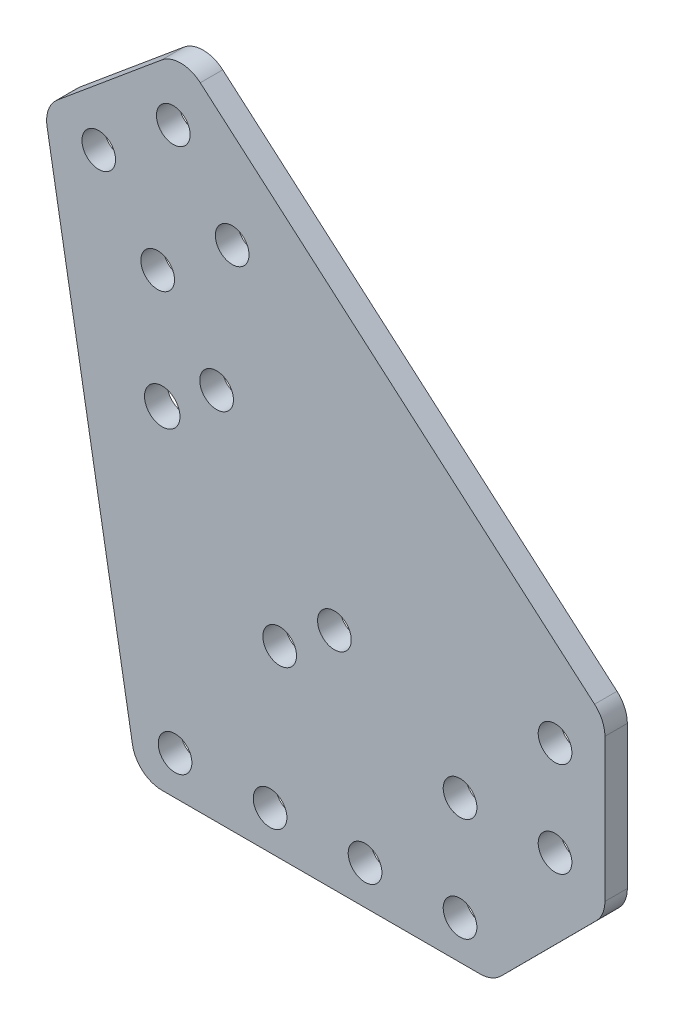
ISO-10303-21;
HEADER;
FILE_DESCRIPTION(('STEP AP214'),'2;1');
FILE_NAME('part.step','',(''),(''),'','','');
FILE_SCHEMA(('AUTOMOTIVE_DESIGN { 1 0 10303 214 1 1 1 1 }'));
ENDSEC;
DATA;
#1=APPLICATION_CONTEXT('core data for automotive mechanical design processes');
#2=APPLICATION_PROTOCOL_DEFINITION('international standard','automotive_design',2000,#1);
#3=PRODUCT_CONTEXT('',#1,'mechanical');
#4=PRODUCT('Part','Part','',(#3));
#5=PRODUCT_RELATED_PRODUCT_CATEGORY('part','',(#4));
#6=PRODUCT_DEFINITION_FORMATION('','',#4);
#7=PRODUCT_DEFINITION_CONTEXT('part definition',#1,'design');
#8=PRODUCT_DEFINITION('design','',#6,#7);
#9=PRODUCT_DEFINITION_SHAPE('','',#8);
#10=(LENGTH_UNIT() NAMED_UNIT(*) SI_UNIT(.MILLI.,.METRE.));
#11=(NAMED_UNIT(*) PLANE_ANGLE_UNIT() SI_UNIT($,.RADIAN.));
#12=(NAMED_UNIT(*) SI_UNIT($,.STERADIAN.) SOLID_ANGLE_UNIT());
#13=UNCERTAINTY_MEASURE_WITH_UNIT(LENGTH_MEASURE(1.E-05),#10,'distance_accuracy_value','');
#14=(GEOMETRIC_REPRESENTATION_CONTEXT(3) GLOBAL_UNCERTAINTY_ASSIGNED_CONTEXT((#13)) GLOBAL_UNIT_ASSIGNED_CONTEXT((#10,
#11,#12)) REPRESENTATION_CONTEXT('',''));
#15=CARTESIAN_POINT('',(0.,0.,0.));
#16=DIRECTION('',(0.,0.,1.));
#17=DIRECTION('',(1.,0.,0.));
#18=AXIS2_PLACEMENT_3D('',#15,#16,#17);
#19=CARTESIAN_POINT('',(0.,0.,3.));
#20=DIRECTION('',(0.,0.,1.));
#21=DIRECTION('',(1.,0.,0.));
#22=AXIS2_PLACEMENT_3D('',#19,#20,#21);
#23=PLANE('',#22);
#24=CARTESIAN_POINT('',(-164.189999824985,19.901668358418,3.));
#25=DIRECTION('',(0.,0.,1.));
#26=DIRECTION('',(1.,0.,0.));
#27=AXIS2_PLACEMENT_3D('',#24,#25,#26);
#28=CIRCLE('',#27,2.36830106821784);
#29=CARTESIAN_POINT('',(-161.821698756767,19.901668358418,3.));
#30=VERTEX_POINT('',#29);
#31=EDGE_CURVE('E329',#30,#30,#28,.T.);
#32=ORIENTED_EDGE('',*,*,#31,.F.);
#33=EDGE_LOOP('',(#32));
#34=FACE_BOUND('',#33,.T.);
#35=CARTESIAN_POINT('',(-149.776854941466,-19.3863630538156,3.));
#36=DIRECTION('',(0.,0.,1.));
#37=DIRECTION('',(1.,0.,0.));
#38=AXIS2_PLACEMENT_3D('',#35,#36,#37);
#39=CIRCLE('',#38,2.25000000048249);
#40=CARTESIAN_POINT('',(-147.526854940983,-19.3863630538156,3.));
#41=VERTEX_POINT('',#40);
#42=EDGE_CURVE('E317',#41,#41,#39,.T.);
#43=ORIENTED_EDGE('',*,*,#42,.F.);
#44=EDGE_LOOP('',(#43));
#45=FACE_BOUND('',#44,.T.);
#46=CARTESIAN_POINT('',(-124.376854941466,-5.51796305374064,3.));
#47=DIRECTION('',(0.,0.,1.));
#48=DIRECTION('',(1.,0.,0.));
#49=AXIS2_PLACEMENT_3D('',#46,#47,#48);
#50=CIRCLE('',#49,2.25000000029453);
#51=CARTESIAN_POINT('',(-122.126854941172,-5.51796305374064,3.));
#52=VERTEX_POINT('',#51);
#53=EDGE_CURVE('E305',#52,#52,#50,.T.);
#54=ORIENTED_EDGE('',*,*,#53,.F.);
#55=EDGE_LOOP('',(#54));
#56=FACE_BOUND('',#55,.T.);
#57=CARTESIAN_POINT('',(-141.172189922376,5.48847701010607,3.));
#58=DIRECTION('',(0.,0.,1.));
#59=DIRECTION('',(1.,0.,0.));
#60=AXIS2_PLACEMENT_3D('',#57,#58,#59);
#61=CIRCLE('',#60,2.25000000002542);
#62=CARTESIAN_POINT('',(-138.922189922351,5.48847701010607,3.));
#63=VERTEX_POINT('',#62);
#64=EDGE_CURVE('E293',#63,#63,#61,.T.);
#65=ORIENTED_EDGE('',*,*,#64,.F.);
#66=EDGE_LOOP('',(#65));
#67=FACE_BOUND('',#66,.T.);
#68=CARTESIAN_POINT('',(-111.676854941467,7.18203694625944,3.));
#69=DIRECTION('',(0.,0.,1.));
#70=DIRECTION('',(1.,0.,0.));
#71=AXIS2_PLACEMENT_3D('',#68,#69,#70);
#72=CIRCLE('',#71,2.25000000029456);
#73=CARTESIAN_POINT('',(-109.426854941172,7.18203694625944,3.));
#74=VERTEX_POINT('',#73);
#75=EDGE_CURVE('E281',#74,#74,#72,.T.);
#76=ORIENTED_EDGE('',*,*,#75,.F.);
#77=EDGE_LOOP('',(#76));
#78=FACE_BOUND('',#77,.T.);
#79=CARTESIAN_POINT('',(-162.712910790992,53.2161141238411,3.));
#80=DIRECTION('',(0.,0.,1.));
#81=DIRECTION('',(1.,0.,0.));
#82=AXIS2_PLACEMENT_3D('',#79,#80,#81);
#83=CIRCLE('',#82,2.2499999999438);
#84=CARTESIAN_POINT('',(-160.462910791048,53.2161141238411,3.));
#85=VERTEX_POINT('',#84);
#86=EDGE_CURVE('E269',#85,#85,#83,.T.);
#87=ORIENTED_EDGE('',*,*,#86,.F.);
#88=EDGE_LOOP('',(#87));
#89=FACE_BOUND('',#88,.T.);
#90=CARTESIAN_POINT('',(-154.836997815216,43.2531830893514,3.));
#91=DIRECTION('',(0.,0.,1.));
#92=DIRECTION('',(1.,0.,0.));
#93=AXIS2_PLACEMENT_3D('',#90,#91,#92);
#94=CIRCLE('',#93,2.24999999995231);
#95=CARTESIAN_POINT('',(-152.586997815263,43.2531830893514,3.));
#96=VERTEX_POINT('',#95);
#97=EDGE_CURVE('E258',#96,#96,#94,.T.);
#98=ORIENTED_EDGE('',*,*,#97,.F.);
#99=EDGE_LOOP('',(#98));
#100=FACE_BOUND('',#99,.T.);
#101=DIRECTION('',(1.,0.,0.));
#102=VECTOR('',#101,1.);
#103=CARTESIAN_POINT('',(-120.053839996217,-24.5679630538153,3.));
#104=LINE('',#103,#102);
#105=CARTESIAN_POINT('',(-164.224876802473,-24.5679630538149,3.));
#106=VERTEX_POINT('',#105);
#107=CARTESIAN_POINT('',(-121.714126708499,-24.5679630538153,3.));
#108=VERTEX_POINT('',#107);
#109=EDGE_CURVE('E174',#106,#108,#104,.T.);
#110=ORIENTED_EDGE('',*,*,#109,.T.);
#111=CARTESIAN_POINT('',(-121.714126708499,-20.5679630538153,3.));
#112=DIRECTION('',(0.,0.,1.));
#113=DIRECTION('',(1.,0.,0.));
#114=AXIS2_PLACEMENT_3D('',#111,#112,#113);
#115=CIRCLE('',#114,4.);
#116=CARTESIAN_POINT('',(-118.881560526476,-23.3922450553974,3.));
#117=VERTEX_POINT('',#116);
#118=EDGE_CURVE('E206',#108,#117,#115,.T.);
#119=ORIENTED_EDGE('',*,*,#118,.T.);
#120=DIRECTION('',(0.706070500395531,0.708141545505703,0.));
#121=VECTOR('',#120,1.);
#122=CARTESIAN_POINT('',(-105.010365496768,-9.48036305374793,3.));
#123=LINE('',#122,#121);
#124=CARTESIAN_POINT('',(-106.177799314745,-10.6512211871421,3.));
#125=VERTEX_POINT('',#124);
#126=EDGE_CURVE('E156',#117,#125,#123,.T.);
#127=ORIENTED_EDGE('',*,*,#126,.T.);
#128=CARTESIAN_POINT('',(-109.010365496768,-7.82693918555994,3.));
#129=DIRECTION('',(0.,0.,1.));
#130=DIRECTION('',(1.,0.,0.));
#131=AXIS2_PLACEMENT_3D('',#128,#129,#130);
#132=CIRCLE('',#131,4.);
#133=CARTESIAN_POINT('',(-105.010365496768,-7.82693918556071,3.));
#134=VERTEX_POINT('',#133);
#135=EDGE_CURVE('E199',#125,#134,#132,.T.);
#136=ORIENTED_EDGE('',*,*,#135,.T.);
#137=DIRECTION('',(1.91570899527326E-13,1.,0.));
#138=VECTOR('',#137,1.);
#139=CARTESIAN_POINT('',(-105.010365496764,13.12155512235,3.));
#140=LINE('',#139,#138);
#141=CARTESIAN_POINT('',(-105.010365496764,11.2928322886602,3.));
#142=VERTEX_POINT('',#141);
#143=EDGE_CURVE('E226',#134,#142,#140,.T.);
#144=ORIENTED_EDGE('',*,*,#143,.T.);
#145=CARTESIAN_POINT('',(-109.010365496764,11.292832288661,3.));
#146=DIRECTION('',(0.,0.,1.));
#147=DIRECTION('',(1.,0.,0.));
#148=AXIS2_PLACEMENT_3D('',#145,#146,#147);
#149=CIRCLE('',#148,4.);
#150=CARTESIAN_POINT('',(-106.393404340325,14.3179792777652,3.));
#151=VERTEX_POINT('',#150);
#152=EDGE_CURVE('E197',#142,#151,#149,.T.);
#153=ORIENTED_EDGE('',*,*,#152,.T.);
#154=DIRECTION('',(-0.756286747276044,0.654240289109912,0.));
#155=VECTOR('',#154,1.);
#156=CARTESIAN_POINT('',(-161.669401761564,62.1355361290031,3.));
#157=LINE('',#156,#155);
#158=CARTESIAN_POINT('',(-159.101930953408,59.9144964904545,3.));
#159=VERTEX_POINT('',#158);
#160=EDGE_CURVE('E235',#151,#159,#157,.T.);
#161=ORIENTED_EDGE('',*,*,#160,.T.);
#162=CARTESIAN_POINT('',(-161.718892109848,56.8893495013503,3.));
#163=DIRECTION('',(0.,0.,1.));
#164=DIRECTION('',(1.,0.,0.));
#165=AXIS2_PLACEMENT_3D('',#162,#163,#164);
#166=CIRCLE('',#165,4.);
#167=CARTESIAN_POINT('',(-164.278316643186,59.9633283656472,3.));
#168=VERTEX_POINT('',#167);
#169=EDGE_CURVE('E201',#159,#168,#166,.T.);
#170=ORIENTED_EDGE('',*,*,#169,.T.);
#171=DIRECTION('',(-0.768494716074212,-0.639856133334686,0.));
#172=VECTOR('',#171,1.);
#173=CARTESIAN_POINT('',(-179.984838949856,46.885925982688,3.));
#174=LINE('',#173,#172);
#175=CARTESIAN_POINT('',(-178.207956373986,48.3653756010192,3.));
#176=VERTEX_POINT('',#175);
#177=EDGE_CURVE('E251',#168,#176,#174,.T.);
#178=ORIENTED_EDGE('',*,*,#177,.T.);
#179=CARTESIAN_POINT('',(-175.648531840647,45.2913967367224,3.));
#180=DIRECTION('',(0.,0.,1.));
#181=DIRECTION('',(1.,0.,0.));
#182=AXIS2_PLACEMENT_3D('',#179,#180,#181);
#183=CIRCLE('',#182,4.);
#184=CARTESIAN_POINT('',(-179.589683005168,44.6077831774656,3.));
#185=VERTEX_POINT('',#184);
#186=EDGE_CURVE('E67',#176,#185,#183,.T.);
#187=ORIENTED_EDGE('',*,*,#186,.T.);
#188=DIRECTION('',(0.170903389814183,-0.985287791130095,0.));
#189=VECTOR('',#188,1.);
#190=CARTESIAN_POINT('',(-167.590783160594,-24.5679630538149,3.));
#191=LINE('',#190,#189);
#192=CARTESIAN_POINT('',(-168.166027966994,-21.2515766130716,3.));
#193=VERTEX_POINT('',#192);
#194=EDGE_CURVE('E252',#185,#193,#191,.T.);
#195=ORIENTED_EDGE('',*,*,#194,.T.);
#196=CARTESIAN_POINT('',(-164.224876802473,-20.5679630538149,3.));
#197=DIRECTION('',(0.,0.,1.));
#198=DIRECTION('',(1.,0.,0.));
#199=AXIS2_PLACEMENT_3D('',#196,#197,#198);
#200=CIRCLE('',#199,4.);
#201=EDGE_CURVE('E204',#193,#106,#200,.T.);
#202=ORIENTED_EDGE('',*,*,#201,.T.);
#203=EDGE_LOOP('',(#110,#119,#127,#136,#144,#153,#161,#170,#178,#187,#195,#202));
#204=FACE_BOUND('',#203,.T.);
#205=CARTESIAN_POINT('',(-156.924015873929,25.4143390790854,3.));
#206=DIRECTION('',(0.,0.,1.));
#207=DIRECTION('',(1.,0.,0.));
#208=AXIS2_PLACEMENT_3D('',#205,#206,#207);
#209=CIRCLE('',#208,2.25000000002542);
#210=CARTESIAN_POINT('',(-154.674015873903,25.4143390790854,3.));
#211=VERTEX_POINT('',#210);
#212=EDGE_CURVE('E165',#211,#211,#209,.T.);
#213=ORIENTED_EDGE('',*,*,#212,.F.);
#214=EDGE_LOOP('',(#213));
#215=FACE_BOUND('',#214,.T.);
#216=CARTESIAN_POINT('',(-164.799928849705,35.3772701135751,3.));
#217=DIRECTION('',(0.,0.,1.));
#218=DIRECTION('',(1.,0.,0.));
#219=AXIS2_PLACEMENT_3D('',#216,#217,#218);
#220=CIRCLE('',#219,2.24999999995565);
#221=CARTESIAN_POINT('',(-162.54992884975,35.3772701135751,3.));
#222=VERTEX_POINT('',#221);
#223=EDGE_CURVE('E263',#222,#222,#220,.T.);
#224=ORIENTED_EDGE('',*,*,#223,.F.);
#225=EDGE_LOOP('',(#224));
#226=FACE_BOUND('',#225,.T.);
#227=CARTESIAN_POINT('',(-172.675841825482,45.3402011480648,3.));
#228=DIRECTION('',(0.,0.,1.));
#229=DIRECTION('',(1.,0.,0.));
#230=AXIS2_PLACEMENT_3D('',#227,#228,#229);
#231=CIRCLE('',#230,2.24999999994711);
#232=CARTESIAN_POINT('',(-170.425841825535,45.3402011480648,3.));
#233=VERTEX_POINT('',#232);
#234=EDGE_CURVE('E275',#233,#233,#231,.T.);
#235=ORIENTED_EDGE('',*,*,#234,.F.);
#236=EDGE_LOOP('',(#235));
#237=FACE_BOUND('',#236,.T.);
#238=CARTESIAN_POINT('',(-124.376854941466,-19.3863630538154,3.));
#239=DIRECTION('',(0.,0.,1.));
#240=DIRECTION('',(1.,0.,0.));
#241=AXIS2_PLACEMENT_3D('',#238,#239,#240);
#242=CIRCLE('',#241,2.25000000048252);
#243=CARTESIAN_POINT('',(-122.126854940983,-19.3863630538154,3.));
#244=VERTEX_POINT('',#243);
#245=EDGE_CURVE('E287',#244,#244,#242,.T.);
#246=ORIENTED_EDGE('',*,*,#245,.F.);
#247=EDGE_LOOP('',(#246));
#248=FACE_BOUND('',#247,.T.);
#249=CARTESIAN_POINT('',(-148.48974020635,0.,3.));
#250=DIRECTION('',(0.,0.,1.));
#251=DIRECTION('',(1.,0.,0.));
#252=AXIS2_PLACEMENT_3D('',#249,#250,#251);
#253=CIRCLE('',#252,2.25000000000001);
#254=CARTESIAN_POINT('',(-146.23974020635,0.,3.));
#255=VERTEX_POINT('',#254);
#256=EDGE_CURVE('E299',#255,#255,#253,.T.);
#257=ORIENTED_EDGE('',*,*,#256,.F.);
#258=EDGE_LOOP('',(#257));
#259=FACE_BOUND('',#258,.T.);
#260=CARTESIAN_POINT('',(-137.076854941466,-19.3863630538155,3.));
#261=DIRECTION('',(0.,0.,1.));
#262=DIRECTION('',(1.,0.,0.));
#263=AXIS2_PLACEMENT_3D('',#260,#261,#262);
#264=CIRCLE('',#263,2.25000000048252);
#265=CARTESIAN_POINT('',(-134.826854940983,-19.3863630538155,3.));
#266=VERTEX_POINT('',#265);
#267=EDGE_CURVE('E311',#266,#266,#264,.T.);
#268=ORIENTED_EDGE('',*,*,#267,.F.);
#269=EDGE_LOOP('',(#268));
#270=FACE_BOUND('',#269,.T.);
#271=CARTESIAN_POINT('',(-162.476854941466,-19.3863630538156,3.));
#272=DIRECTION('',(0.,0.,1.));
#273=DIRECTION('',(1.,0.,0.));
#274=AXIS2_PLACEMENT_3D('',#271,#272,#273);
#275=CIRCLE('',#274,2.25000000048249);
#276=CARTESIAN_POINT('',(-160.226854940983,-19.3863630538156,3.));
#277=VERTEX_POINT('',#276);
#278=EDGE_CURVE('E323',#277,#277,#275,.T.);
#279=ORIENTED_EDGE('',*,*,#278,.F.);
#280=EDGE_LOOP('',(#279));
#281=FACE_BOUND('',#280,.T.);
#282=CARTESIAN_POINT('',(-111.676854941474,-5.51796305378864,3.));
#283=DIRECTION('',(0.,0.,1.));
#284=DIRECTION('',(1.,0.,0.));
#285=AXIS2_PLACEMENT_3D('',#282,#283,#284);
#286=CIRCLE('',#285,2.25);
#287=CARTESIAN_POINT('',(-109.426854941474,-5.51796305378864,3.));
#288=VERTEX_POINT('',#287);
#289=EDGE_CURVE('E335',#288,#288,#286,.T.);
#290=ORIENTED_EDGE('',*,*,#289,.F.);
#291=EDGE_LOOP('',(#290));
#292=FACE_BOUND('',#291,.T.);
#293=ADVANCED_FACE('F45',(#34,#45,#56,#67,#78,#89,#100,#204,#215,#226,#237,#248,#259,#270,#281,
#292),#23,.T.);
#294=CARTESIAN_POINT('',(0.,0.,0.));
#295=DIRECTION('',(0.,0.,1.));
#296=DIRECTION('',(1.,0.,0.));
#297=AXIS2_PLACEMENT_3D('',#294,#295,#296);
#298=PLANE('',#297);
#299=DIRECTION('',(0.706070500395531,0.708141545505703,0.));
#300=VECTOR('',#299,1.);
#301=CARTESIAN_POINT('',(-105.010365496768,-9.48036305374793,0.));
#302=LINE('',#301,#300);
#303=CARTESIAN_POINT('',(-118.881560526476,-23.3922450553974,0.));
#304=VERTEX_POINT('',#303);
#305=CARTESIAN_POINT('',(-106.177799314745,-10.6512211871421,0.));
#306=VERTEX_POINT('',#305);
#307=EDGE_CURVE('E153',#304,#306,#302,.T.);
#308=ORIENTED_EDGE('',*,*,#307,.F.);
#309=CARTESIAN_POINT('',(-121.714126708499,-20.5679630538153,0.));
#310=DIRECTION('',(0.,0.,1.));
#311=DIRECTION('',(1.,0.,0.));
#312=AXIS2_PLACEMENT_3D('',#309,#310,#311);
#313=CIRCLE('',#312,4.);
#314=CARTESIAN_POINT('',(-121.714126708499,-24.5679630538153,0.));
#315=VERTEX_POINT('',#314);
#316=EDGE_CURVE('E136',#304,#315,#313,.F.);
#317=ORIENTED_EDGE('',*,*,#316,.T.);
#318=DIRECTION('',(1.,0.,0.));
#319=VECTOR('',#318,1.);
#320=CARTESIAN_POINT('',(-120.053839996217,-24.5679630538153,0.));
#321=LINE('',#320,#319);
#322=CARTESIAN_POINT('',(-164.224876802473,-24.5679630538149,0.));
#323=VERTEX_POINT('',#322);
#324=EDGE_CURVE('E184',#323,#315,#321,.T.);
#325=ORIENTED_EDGE('',*,*,#324,.F.);
#326=CARTESIAN_POINT('',(-164.224876802473,-20.5679630538149,0.));
#327=DIRECTION('',(0.,0.,1.));
#328=DIRECTION('',(1.,0.,0.));
#329=AXIS2_PLACEMENT_3D('',#326,#327,#328);
#330=CIRCLE('',#329,4.);
#331=CARTESIAN_POINT('',(-168.166027966994,-21.2515766130716,0.));
#332=VERTEX_POINT('',#331);
#333=EDGE_CURVE('E147',#323,#332,#330,.F.);
#334=ORIENTED_EDGE('',*,*,#333,.T.);
#335=DIRECTION('',(0.170903389814183,-0.985287791130095,0.));
#336=VECTOR('',#335,1.);
#337=CARTESIAN_POINT('',(-167.590783160594,-24.5679630538149,0.));
#338=LINE('',#337,#336);
#339=CARTESIAN_POINT('',(-179.589683005168,44.6077831774656,0.));
#340=VERTEX_POINT('',#339);
#341=EDGE_CURVE('E182',#340,#332,#338,.T.);
#342=ORIENTED_EDGE('',*,*,#341,.F.);
#343=CARTESIAN_POINT('',(-175.648531840647,45.2913967367224,0.));
#344=DIRECTION('',(0.,0.,1.));
#345=DIRECTION('',(1.,0.,0.));
#346=AXIS2_PLACEMENT_3D('',#343,#344,#345);
#347=CIRCLE('',#346,4.);
#348=CARTESIAN_POINT('',(-178.207956373986,48.3653756010192,0.));
#349=VERTEX_POINT('',#348);
#350=EDGE_CURVE('E191',#340,#349,#347,.F.);
#351=ORIENTED_EDGE('',*,*,#350,.T.);
#352=DIRECTION('',(-0.768494716074212,-0.639856133334686,0.));
#353=VECTOR('',#352,1.);
#354=CARTESIAN_POINT('',(-179.984838949856,46.885925982688,0.));
#355=LINE('',#354,#353);
#356=CARTESIAN_POINT('',(-164.278316643186,59.9633283656472,0.));
#357=VERTEX_POINT('',#356);
#358=EDGE_CURVE('E179',#357,#349,#355,.T.);
#359=ORIENTED_EDGE('',*,*,#358,.F.);
#360=CARTESIAN_POINT('',(-161.718892109848,56.8893495013503,0.));
#361=DIRECTION('',(0.,0.,1.));
#362=DIRECTION('',(1.,0.,0.));
#363=AXIS2_PLACEMENT_3D('',#360,#361,#362);
#364=CIRCLE('',#363,4.);
#365=CARTESIAN_POINT('',(-159.101930953408,59.9144964904545,0.));
#366=VERTEX_POINT('',#365);
#367=EDGE_CURVE('E189',#357,#366,#364,.F.);
#368=ORIENTED_EDGE('',*,*,#367,.T.);
#369=DIRECTION('',(-0.756286747276044,0.654240289109912,0.));
#370=VECTOR('',#369,1.);
#371=CARTESIAN_POINT('',(-161.669401761564,62.1355361290031,0.));
#372=LINE('',#371,#370);
#373=CARTESIAN_POINT('',(-106.393404340325,14.3179792777652,0.));
#374=VERTEX_POINT('',#373);
#375=EDGE_CURVE('E168',#374,#366,#372,.T.);
#376=ORIENTED_EDGE('',*,*,#375,.F.);
#377=CARTESIAN_POINT('',(-109.010365496764,11.292832288661,0.));
#378=DIRECTION('',(0.,0.,1.));
#379=DIRECTION('',(1.,0.,0.));
#380=AXIS2_PLACEMENT_3D('',#377,#378,#379);
#381=CIRCLE('',#380,4.);
#382=CARTESIAN_POINT('',(-105.010365496764,11.2928322886602,0.));
#383=VERTEX_POINT('',#382);
#384=EDGE_CURVE('E157',#374,#383,#381,.F.);
#385=ORIENTED_EDGE('',*,*,#384,.T.);
#386=DIRECTION('',(1.91570899527326E-13,1.,0.));
#387=VECTOR('',#386,1.);
#388=CARTESIAN_POINT('',(-105.010365496764,13.12155512235,0.));
#389=LINE('',#388,#387);
#390=CARTESIAN_POINT('',(-105.010365496768,-7.82693918556071,0.));
#391=VERTEX_POINT('',#390);
#392=EDGE_CURVE('E164',#391,#383,#389,.T.);
#393=ORIENTED_EDGE('',*,*,#392,.F.);
#394=CARTESIAN_POINT('',(-109.010365496768,-7.82693918555994,0.));
#395=DIRECTION('',(0.,0.,1.));
#396=DIRECTION('',(1.,0.,0.));
#397=AXIS2_PLACEMENT_3D('',#394,#395,#396);
#398=CIRCLE('',#397,4.);
#399=EDGE_CURVE('E163',#391,#306,#398,.F.);
#400=ORIENTED_EDGE('',*,*,#399,.T.);
#401=EDGE_LOOP('',(#308,#317,#325,#334,#342,#351,#359,#368,#376,#385,#393,#400));
#402=FACE_BOUND('',#401,.T.);
#403=CARTESIAN_POINT('',(-156.924015873929,25.4143390790854,0.));
#404=DIRECTION('',(0.,0.,1.));
#405=DIRECTION('',(1.,0.,0.));
#406=AXIS2_PLACEMENT_3D('',#403,#404,#405);
#407=CIRCLE('',#406,2.25000000002542);
#408=CARTESIAN_POINT('',(-154.674015873903,25.4143390790854,0.));
#409=VERTEX_POINT('',#408);
#410=EDGE_CURVE('E171',#409,#409,#407,.T.);
#411=ORIENTED_EDGE('',*,*,#410,.T.);
#412=EDGE_LOOP('',(#411));
#413=FACE_BOUND('',#412,.T.);
#414=CARTESIAN_POINT('',(-154.836997815216,43.2531830893514,0.));
#415=DIRECTION('',(0.,0.,1.));
#416=DIRECTION('',(1.,0.,0.));
#417=AXIS2_PLACEMENT_3D('',#414,#415,#416);
#418=CIRCLE('',#417,2.24999999995231);
#419=CARTESIAN_POINT('',(-152.586997815263,43.2531830893514,0.));
#420=VERTEX_POINT('',#419);
#421=EDGE_CURVE('E260',#420,#420,#418,.T.);
#422=ORIENTED_EDGE('',*,*,#421,.T.);
#423=EDGE_LOOP('',(#422));
#424=FACE_BOUND('',#423,.T.);
#425=CARTESIAN_POINT('',(-164.799928849705,35.3772701135751,0.));
#426=DIRECTION('',(0.,0.,1.));
#427=DIRECTION('',(1.,0.,0.));
#428=AXIS2_PLACEMENT_3D('',#425,#426,#427);
#429=CIRCLE('',#428,2.24999999995565);
#430=CARTESIAN_POINT('',(-162.54992884975,35.3772701135751,0.));
#431=VERTEX_POINT('',#430);
#432=EDGE_CURVE('E266',#431,#431,#429,.T.);
#433=ORIENTED_EDGE('',*,*,#432,.T.);
#434=EDGE_LOOP('',(#433));
#435=FACE_BOUND('',#434,.T.);
#436=CARTESIAN_POINT('',(-162.712910790992,53.2161141238411,0.));
#437=DIRECTION('',(0.,0.,1.));
#438=DIRECTION('',(1.,0.,0.));
#439=AXIS2_PLACEMENT_3D('',#436,#437,#438);
#440=CIRCLE('',#439,2.2499999999438);
#441=CARTESIAN_POINT('',(-160.462910791048,53.2161141238411,0.));
#442=VERTEX_POINT('',#441);
#443=EDGE_CURVE('E272',#442,#442,#440,.T.);
#444=ORIENTED_EDGE('',*,*,#443,.T.);
#445=EDGE_LOOP('',(#444));
#446=FACE_BOUND('',#445,.T.);
#447=CARTESIAN_POINT('',(-172.675841825482,45.3402011480648,0.));
#448=DIRECTION('',(0.,0.,1.));
#449=DIRECTION('',(1.,0.,0.));
#450=AXIS2_PLACEMENT_3D('',#447,#448,#449);
#451=CIRCLE('',#450,2.24999999994711);
#452=CARTESIAN_POINT('',(-170.425841825535,45.3402011480648,0.));
#453=VERTEX_POINT('',#452);
#454=EDGE_CURVE('E278',#453,#453,#451,.T.);
#455=ORIENTED_EDGE('',*,*,#454,.T.);
#456=EDGE_LOOP('',(#455));
#457=FACE_BOUND('',#456,.T.);
#458=CARTESIAN_POINT('',(-111.676854941467,7.18203694625944,0.));
#459=DIRECTION('',(0.,0.,1.));
#460=DIRECTION('',(1.,0.,0.));
#461=AXIS2_PLACEMENT_3D('',#458,#459,#460);
#462=CIRCLE('',#461,2.25000000029456);
#463=CARTESIAN_POINT('',(-109.426854941172,7.18203694625944,0.));
#464=VERTEX_POINT('',#463);
#465=EDGE_CURVE('E284',#464,#464,#462,.T.);
#466=ORIENTED_EDGE('',*,*,#465,.T.);
#467=EDGE_LOOP('',(#466));
#468=FACE_BOUND('',#467,.T.);
#469=CARTESIAN_POINT('',(-124.376854941466,-19.3863630538154,0.));
#470=DIRECTION('',(0.,0.,1.));
#471=DIRECTION('',(1.,0.,0.));
#472=AXIS2_PLACEMENT_3D('',#469,#470,#471);
#473=CIRCLE('',#472,2.25000000048252);
#474=CARTESIAN_POINT('',(-122.126854940983,-19.3863630538154,0.));
#475=VERTEX_POINT('',#474);
#476=EDGE_CURVE('E290',#475,#475,#473,.T.);
#477=ORIENTED_EDGE('',*,*,#476,.T.);
#478=EDGE_LOOP('',(#477));
#479=FACE_BOUND('',#478,.T.);
#480=CARTESIAN_POINT('',(-141.172189922376,5.48847701010607,0.));
#481=DIRECTION('',(0.,0.,1.));
#482=DIRECTION('',(1.,0.,0.));
#483=AXIS2_PLACEMENT_3D('',#480,#481,#482);
#484=CIRCLE('',#483,2.25000000002542);
#485=CARTESIAN_POINT('',(-138.922189922351,5.48847701010607,0.));
#486=VERTEX_POINT('',#485);
#487=EDGE_CURVE('E296',#486,#486,#484,.T.);
#488=ORIENTED_EDGE('',*,*,#487,.T.);
#489=EDGE_LOOP('',(#488));
#490=FACE_BOUND('',#489,.T.);
#491=CARTESIAN_POINT('',(-148.48974020635,0.,0.));
#492=DIRECTION('',(0.,0.,1.));
#493=DIRECTION('',(1.,0.,0.));
#494=AXIS2_PLACEMENT_3D('',#491,#492,#493);
#495=CIRCLE('',#494,2.25000000000001);
#496=CARTESIAN_POINT('',(-146.23974020635,0.,0.));
#497=VERTEX_POINT('',#496);
#498=EDGE_CURVE('E302',#497,#497,#495,.T.);
#499=ORIENTED_EDGE('',*,*,#498,.T.);
#500=EDGE_LOOP('',(#499));
#501=FACE_BOUND('',#500,.T.);
#502=CARTESIAN_POINT('',(-124.376854941466,-5.51796305374064,0.));
#503=DIRECTION('',(0.,0.,1.));
#504=DIRECTION('',(1.,0.,0.));
#505=AXIS2_PLACEMENT_3D('',#502,#503,#504);
#506=CIRCLE('',#505,2.25000000029453);
#507=CARTESIAN_POINT('',(-122.126854941172,-5.51796305374064,0.));
#508=VERTEX_POINT('',#507);
#509=EDGE_CURVE('E308',#508,#508,#506,.T.);
#510=ORIENTED_EDGE('',*,*,#509,.T.);
#511=EDGE_LOOP('',(#510));
#512=FACE_BOUND('',#511,.T.);
#513=CARTESIAN_POINT('',(-137.076854941466,-19.3863630538155,0.));
#514=DIRECTION('',(0.,0.,1.));
#515=DIRECTION('',(1.,0.,0.));
#516=AXIS2_PLACEMENT_3D('',#513,#514,#515);
#517=CIRCLE('',#516,2.25000000048252);
#518=CARTESIAN_POINT('',(-134.826854940983,-19.3863630538155,0.));
#519=VERTEX_POINT('',#518);
#520=EDGE_CURVE('E314',#519,#519,#517,.T.);
#521=ORIENTED_EDGE('',*,*,#520,.T.);
#522=EDGE_LOOP('',(#521));
#523=FACE_BOUND('',#522,.T.);
#524=CARTESIAN_POINT('',(-149.776854941466,-19.3863630538156,0.));
#525=DIRECTION('',(0.,0.,1.));
#526=DIRECTION('',(1.,0.,0.));
#527=AXIS2_PLACEMENT_3D('',#524,#525,#526);
#528=CIRCLE('',#527,2.25000000048249);
#529=CARTESIAN_POINT('',(-147.526854940983,-19.3863630538156,0.));
#530=VERTEX_POINT('',#529);
#531=EDGE_CURVE('E320',#530,#530,#528,.T.);
#532=ORIENTED_EDGE('',*,*,#531,.T.);
#533=EDGE_LOOP('',(#532));
#534=FACE_BOUND('',#533,.T.);
#535=CARTESIAN_POINT('',(-162.476854941466,-19.3863630538156,0.));
#536=DIRECTION('',(0.,0.,1.));
#537=DIRECTION('',(1.,0.,0.));
#538=AXIS2_PLACEMENT_3D('',#535,#536,#537);
#539=CIRCLE('',#538,2.25000000048249);
#540=CARTESIAN_POINT('',(-160.226854940983,-19.3863630538156,0.));
#541=VERTEX_POINT('',#540);
#542=EDGE_CURVE('E326',#541,#541,#539,.T.);
#543=ORIENTED_EDGE('',*,*,#542,.T.);
#544=EDGE_LOOP('',(#543));
#545=FACE_BOUND('',#544,.T.);
#546=CARTESIAN_POINT('',(-164.189999824985,19.901668358418,0.));
#547=DIRECTION('',(0.,0.,1.));
#548=DIRECTION('',(1.,0.,0.));
#549=AXIS2_PLACEMENT_3D('',#546,#547,#548);
#550=CIRCLE('',#549,2.36830106821784);
#551=CARTESIAN_POINT('',(-161.821698756767,19.901668358418,0.));
#552=VERTEX_POINT('',#551);
#553=EDGE_CURVE('E332',#552,#552,#550,.T.);
#554=ORIENTED_EDGE('',*,*,#553,.T.);
#555=EDGE_LOOP('',(#554));
#556=FACE_BOUND('',#555,.T.);
#557=CARTESIAN_POINT('',(-111.676854941474,-5.51796305378864,0.));
#558=DIRECTION('',(0.,0.,1.));
#559=DIRECTION('',(1.,0.,0.));
#560=AXIS2_PLACEMENT_3D('',#557,#558,#559);
#561=CIRCLE('',#560,2.25);
#562=CARTESIAN_POINT('',(-109.426854941474,-5.51796305378864,0.));
#563=VERTEX_POINT('',#562);
#564=EDGE_CURVE('E338',#563,#563,#561,.T.);
#565=ORIENTED_EDGE('',*,*,#564,.T.);
#566=EDGE_LOOP('',(#565));
#567=FACE_BOUND('',#566,.T.);
#568=ADVANCED_FACE('F160',(#402,#413,#424,#435,#446,#457,#468,#479,#490,#501,#512,#523,#534,
#545,#556,#567),#298,.F.);
#569=CARTESIAN_POINT('',(-105.010365496768,-9.48036305374793,3.));
#570=DIRECTION('',(-0.708141545505703,0.70607050039553,0.));
#571=DIRECTION('',(-0.706070500395531,-0.708141545505703,0.));
#572=AXIS2_PLACEMENT_3D('',#569,#570,#571);
#573=PLANE('',#572);
#574=ORIENTED_EDGE('',*,*,#126,.F.);
#575=DIRECTION('',(0.,0.,-1.));
#576=VECTOR('',#575,1.);
#577=CARTESIAN_POINT('',(-118.881560526476,-23.3922450553974,3.));
#578=LINE('',#577,#576);
#579=EDGE_CURVE('E140',#117,#304,#578,.T.);
#580=ORIENTED_EDGE('',*,*,#579,.T.);
#581=ORIENTED_EDGE('',*,*,#307,.T.);
#582=DIRECTION('',(0.,0.,-1.));
#583=VECTOR('',#582,1.);
#584=CARTESIAN_POINT('',(-106.177799314745,-10.6512211871421,3.));
#585=LINE('',#584,#583);
#586=EDGE_CURVE('E158',#306,#125,#585,.F.);
#587=ORIENTED_EDGE('',*,*,#586,.T.);
#588=EDGE_LOOP('',(#574,#580,#581,#587));
#589=FACE_BOUND('',#588,.T.);
#590=ADVANCED_FACE('F152',(#589),#573,.F.);
#591=CARTESIAN_POINT('',(-105.010365496764,13.12155512235,3.));
#592=DIRECTION('',(-1.,1.91570899527326E-13,0.));
#593=DIRECTION('',(-1.91570899527326E-13,-1.,0.));
#594=AXIS2_PLACEMENT_3D('',#591,#592,#593);
#595=PLANE('',#594);
#596=ORIENTED_EDGE('',*,*,#143,.F.);
#597=DIRECTION('',(0.,0.,-1.));
#598=VECTOR('',#597,1.);
#599=CARTESIAN_POINT('',(-105.010365496768,-7.82693918556071,3.));
#600=LINE('',#599,#598);
#601=EDGE_CURVE('E11',#134,#391,#600,.T.);
#602=ORIENTED_EDGE('',*,*,#601,.T.);
#603=ORIENTED_EDGE('',*,*,#392,.T.);
#604=DIRECTION('',(0.,0.,-1.));
#605=VECTOR('',#604,1.);
#606=CARTESIAN_POINT('',(-105.010365496764,11.2928322886602,3.));
#607=LINE('',#606,#605);
#608=EDGE_CURVE('E53',#383,#142,#607,.F.);
#609=ORIENTED_EDGE('',*,*,#608,.T.);
#610=EDGE_LOOP('',(#596,#602,#603,#609));
#611=FACE_BOUND('',#610,.T.);
#612=ADVANCED_FACE('F225',(#611),#595,.F.);
#613=CARTESIAN_POINT('',(-161.669401761564,62.1355361290031,3.));
#614=DIRECTION('',(-0.654240289109912,-0.756286747276044,0.));
#615=DIRECTION('',(0.756286747276044,-0.654240289109912,0.));
#616=AXIS2_PLACEMENT_3D('',#613,#614,#615);
#617=PLANE('',#616);
#618=ORIENTED_EDGE('',*,*,#375,.T.);
#619=DIRECTION('',(0.,0.,-1.));
#620=VECTOR('',#619,1.);
#621=CARTESIAN_POINT('',(-159.101930953408,59.9144964904545,3.));
#622=LINE('',#621,#620);
#623=EDGE_CURVE('E220',#366,#159,#622,.F.);
#624=ORIENTED_EDGE('',*,*,#623,.T.);
#625=ORIENTED_EDGE('',*,*,#160,.F.);
#626=DIRECTION('',(0.,0.,-1.));
#627=VECTOR('',#626,1.);
#628=CARTESIAN_POINT('',(-106.393404340325,14.3179792777652,3.));
#629=LINE('',#628,#627);
#630=EDGE_CURVE('E217',#151,#374,#629,.T.);
#631=ORIENTED_EDGE('',*,*,#630,.T.);
#632=EDGE_LOOP('',(#618,#624,#625,#631));
#633=FACE_BOUND('',#632,.T.);
#634=ADVANCED_FACE('F240',(#633),#617,.F.);
#635=CARTESIAN_POINT('',(-179.984838949856,46.885925982688,3.));
#636=DIRECTION('',(0.639856133334686,-0.768494716074212,0.));
#637=DIRECTION('',(0.768494716074212,0.639856133334687,0.));
#638=AXIS2_PLACEMENT_3D('',#635,#636,#637);
#639=PLANE('',#638);
#640=ORIENTED_EDGE('',*,*,#358,.T.);
#641=DIRECTION('',(0.,0.,-1.));
#642=VECTOR('',#641,1.);
#643=CARTESIAN_POINT('',(-178.207956373986,48.3653756010192,3.));
#644=LINE('',#643,#642);
#645=EDGE_CURVE('E215',#349,#176,#644,.F.);
#646=ORIENTED_EDGE('',*,*,#645,.T.);
#647=ORIENTED_EDGE('',*,*,#177,.F.);
#648=DIRECTION('',(0.,0.,-1.));
#649=VECTOR('',#648,1.);
#650=CARTESIAN_POINT('',(-164.278316643186,59.9633283656472,3.));
#651=LINE('',#650,#649);
#652=EDGE_CURVE('E212',#168,#357,#651,.T.);
#653=ORIENTED_EDGE('',*,*,#652,.T.);
#654=EDGE_LOOP('',(#640,#646,#647,#653));
#655=FACE_BOUND('',#654,.T.);
#656=ADVANCED_FACE('F249',(#655),#639,.F.);
#657=CARTESIAN_POINT('',(-167.590783160594,-24.5679630538149,3.));
#658=DIRECTION('',(0.985287791130095,0.170903389814183,0.));
#659=DIRECTION('',(-0.170903389814183,0.985287791130095,0.));
#660=AXIS2_PLACEMENT_3D('',#657,#658,#659);
#661=PLANE('',#660);
#662=ORIENTED_EDGE('',*,*,#341,.T.);
#663=DIRECTION('',(0.,0.,-1.));
#664=VECTOR('',#663,1.);
#665=CARTESIAN_POINT('',(-168.166027966994,-21.2515766130716,3.));
#666=LINE('',#665,#664);
#667=EDGE_CURVE('E60',#332,#193,#666,.F.);
#668=ORIENTED_EDGE('',*,*,#667,.T.);
#669=ORIENTED_EDGE('',*,*,#194,.F.);
#670=DIRECTION('',(0.,0.,-1.));
#671=VECTOR('',#670,1.);
#672=CARTESIAN_POINT('',(-179.589683005168,44.6077831774656,3.));
#673=LINE('',#672,#671);
#674=EDGE_CURVE('E208',#185,#340,#673,.T.);
#675=ORIENTED_EDGE('',*,*,#674,.T.);
#676=EDGE_LOOP('',(#662,#668,#669,#675));
#677=FACE_BOUND('',#676,.T.);
#678=ADVANCED_FACE('F364',(#677),#661,.F.);
#679=CARTESIAN_POINT('',(-120.053839996217,-24.5679630538153,3.));
#680=DIRECTION('',(0.,1.,0.));
#681=DIRECTION('',(-1.,0.,0.));
#682=AXIS2_PLACEMENT_3D('',#679,#680,#681);
#683=PLANE('',#682);
#684=ORIENTED_EDGE('',*,*,#324,.T.);
#685=DIRECTION('',(0.,0.,-1.));
#686=VECTOR('',#685,1.);
#687=CARTESIAN_POINT('',(-121.714126708499,-24.5679630538153,3.));
#688=LINE('',#687,#686);
#689=EDGE_CURVE('E141',#315,#108,#688,.F.);
#690=ORIENTED_EDGE('',*,*,#689,.T.);
#691=ORIENTED_EDGE('',*,*,#109,.F.);
#692=DIRECTION('',(0.,0.,-1.));
#693=VECTOR('',#692,1.);
#694=CARTESIAN_POINT('',(-164.224876802473,-24.5679630538149,3.));
#695=LINE('',#694,#693);
#696=EDGE_CURVE('E146',#106,#323,#695,.T.);
#697=ORIENTED_EDGE('',*,*,#696,.T.);
#698=EDGE_LOOP('',(#684,#690,#691,#697));
#699=FACE_BOUND('',#698,.T.);
#700=ADVANCED_FACE('F361',(#699),#683,.F.);
#701=CARTESIAN_POINT('',(-156.924015873929,25.4143390790854,3.));
#702=DIRECTION('',(0.,0.,-1.));
#703=DIRECTION('',(-1.,0.,0.));
#704=AXIS2_PLACEMENT_3D('',#701,#702,#703);
#705=CYLINDRICAL_SURFACE('',#704,2.25000000002542);
#706=ORIENTED_EDGE('',*,*,#212,.T.);
#707=EDGE_LOOP('',(#706));
#708=FACE_BOUND('',#707,.T.);
#709=ORIENTED_EDGE('',*,*,#410,.F.);
#710=EDGE_LOOP('',(#709));
#711=FACE_BOUND('',#710,.T.);
#712=ADVANCED_FACE('F358',(#708,#711),#705,.F.);
#713=CARTESIAN_POINT('',(-154.836997815216,43.2531830893514,3.));
#714=DIRECTION('',(0.,0.,-1.));
#715=DIRECTION('',(-1.,0.,0.));
#716=AXIS2_PLACEMENT_3D('',#713,#714,#715);
#717=CYLINDRICAL_SURFACE('',#716,2.24999999995231);
#718=ORIENTED_EDGE('',*,*,#97,.T.);
#719=EDGE_LOOP('',(#718));
#720=FACE_BOUND('',#719,.T.);
#721=ORIENTED_EDGE('',*,*,#421,.F.);
#722=EDGE_LOOP('',(#721));
#723=FACE_BOUND('',#722,.T.);
#724=ADVANCED_FACE('F519',(#720,#723),#717,.F.);
#725=CARTESIAN_POINT('',(-164.799928849705,35.3772701135751,3.));
#726=DIRECTION('',(0.,0.,-1.));
#727=DIRECTION('',(-1.,0.,0.));
#728=AXIS2_PLACEMENT_3D('',#725,#726,#727);
#729=CYLINDRICAL_SURFACE('',#728,2.24999999995565);
#730=ORIENTED_EDGE('',*,*,#223,.T.);
#731=EDGE_LOOP('',(#730));
#732=FACE_BOUND('',#731,.T.);
#733=ORIENTED_EDGE('',*,*,#432,.F.);
#734=EDGE_LOOP('',(#733));
#735=FACE_BOUND('',#734,.T.);
#736=ADVANCED_FACE('F511',(#732,#735),#729,.F.);
#737=CARTESIAN_POINT('',(-162.712910790992,53.2161141238411,3.));
#738=DIRECTION('',(0.,0.,-1.));
#739=DIRECTION('',(-1.,0.,0.));
#740=AXIS2_PLACEMENT_3D('',#737,#738,#739);
#741=CYLINDRICAL_SURFACE('',#740,2.2499999999438);
#742=ORIENTED_EDGE('',*,*,#86,.T.);
#743=EDGE_LOOP('',(#742));
#744=FACE_BOUND('',#743,.T.);
#745=ORIENTED_EDGE('',*,*,#443,.F.);
#746=EDGE_LOOP('',(#745));
#747=FACE_BOUND('',#746,.T.);
#748=ADVANCED_FACE('F503',(#744,#747),#741,.F.);
#749=CARTESIAN_POINT('',(-172.675841825482,45.3402011480648,3.));
#750=DIRECTION('',(0.,0.,-1.));
#751=DIRECTION('',(-1.,0.,0.));
#752=AXIS2_PLACEMENT_3D('',#749,#750,#751);
#753=CYLINDRICAL_SURFACE('',#752,2.24999999994711);
#754=ORIENTED_EDGE('',*,*,#234,.T.);
#755=EDGE_LOOP('',(#754));
#756=FACE_BOUND('',#755,.T.);
#757=ORIENTED_EDGE('',*,*,#454,.F.);
#758=EDGE_LOOP('',(#757));
#759=FACE_BOUND('',#758,.T.);
#760=ADVANCED_FACE('F495',(#756,#759),#753,.F.);
#761=CARTESIAN_POINT('',(-111.676854941467,7.18203694625944,3.));
#762=DIRECTION('',(0.,0.,-1.));
#763=DIRECTION('',(-1.,0.,0.));
#764=AXIS2_PLACEMENT_3D('',#761,#762,#763);
#765=CYLINDRICAL_SURFACE('',#764,2.25000000029456);
#766=ORIENTED_EDGE('',*,*,#75,.T.);
#767=EDGE_LOOP('',(#766));
#768=FACE_BOUND('',#767,.T.);
#769=ORIENTED_EDGE('',*,*,#465,.F.);
#770=EDGE_LOOP('',(#769));
#771=FACE_BOUND('',#770,.T.);
#772=ADVANCED_FACE('F487',(#768,#771),#765,.F.);
#773=CARTESIAN_POINT('',(-124.376854941466,-19.3863630538154,3.));
#774=DIRECTION('',(0.,0.,-1.));
#775=DIRECTION('',(-1.,0.,0.));
#776=AXIS2_PLACEMENT_3D('',#773,#774,#775);
#777=CYLINDRICAL_SURFACE('',#776,2.25000000048252);
#778=ORIENTED_EDGE('',*,*,#245,.T.);
#779=EDGE_LOOP('',(#778));
#780=FACE_BOUND('',#779,.T.);
#781=ORIENTED_EDGE('',*,*,#476,.F.);
#782=EDGE_LOOP('',(#781));
#783=FACE_BOUND('',#782,.T.);
#784=ADVANCED_FACE('F479',(#780,#783),#777,.F.);
#785=CARTESIAN_POINT('',(-141.172189922376,5.48847701010607,3.));
#786=DIRECTION('',(0.,0.,-1.));
#787=DIRECTION('',(-1.,0.,0.));
#788=AXIS2_PLACEMENT_3D('',#785,#786,#787);
#789=CYLINDRICAL_SURFACE('',#788,2.25000000002542);
#790=ORIENTED_EDGE('',*,*,#64,.T.);
#791=EDGE_LOOP('',(#790));
#792=FACE_BOUND('',#791,.T.);
#793=ORIENTED_EDGE('',*,*,#487,.F.);
#794=EDGE_LOOP('',(#793));
#795=FACE_BOUND('',#794,.T.);
#796=ADVANCED_FACE('F471',(#792,#795),#789,.F.);
#797=CARTESIAN_POINT('',(-148.48974020635,0.,3.));
#798=DIRECTION('',(0.,0.,-1.));
#799=DIRECTION('',(-1.,0.,0.));
#800=AXIS2_PLACEMENT_3D('',#797,#798,#799);
#801=CYLINDRICAL_SURFACE('',#800,2.25000000000001);
#802=ORIENTED_EDGE('',*,*,#256,.T.);
#803=EDGE_LOOP('',(#802));
#804=FACE_BOUND('',#803,.T.);
#805=ORIENTED_EDGE('',*,*,#498,.F.);
#806=EDGE_LOOP('',(#805));
#807=FACE_BOUND('',#806,.T.);
#808=ADVANCED_FACE('F463',(#804,#807),#801,.F.);
#809=CARTESIAN_POINT('',(-124.376854941466,-5.51796305374064,3.));
#810=DIRECTION('',(0.,0.,-1.));
#811=DIRECTION('',(-1.,0.,0.));
#812=AXIS2_PLACEMENT_3D('',#809,#810,#811);
#813=CYLINDRICAL_SURFACE('',#812,2.25000000029453);
#814=ORIENTED_EDGE('',*,*,#53,.T.);
#815=EDGE_LOOP('',(#814));
#816=FACE_BOUND('',#815,.T.);
#817=ORIENTED_EDGE('',*,*,#509,.F.);
#818=EDGE_LOOP('',(#817));
#819=FACE_BOUND('',#818,.T.);
#820=ADVANCED_FACE('F455',(#816,#819),#813,.F.);
#821=CARTESIAN_POINT('',(-137.076854941466,-19.3863630538155,3.));
#822=DIRECTION('',(0.,0.,-1.));
#823=DIRECTION('',(-1.,0.,0.));
#824=AXIS2_PLACEMENT_3D('',#821,#822,#823);
#825=CYLINDRICAL_SURFACE('',#824,2.25000000048252);
#826=ORIENTED_EDGE('',*,*,#267,.T.);
#827=EDGE_LOOP('',(#826));
#828=FACE_BOUND('',#827,.T.);
#829=ORIENTED_EDGE('',*,*,#520,.F.);
#830=EDGE_LOOP('',(#829));
#831=FACE_BOUND('',#830,.T.);
#832=ADVANCED_FACE('F447',(#828,#831),#825,.F.);
#833=CARTESIAN_POINT('',(-149.776854941466,-19.3863630538156,3.));
#834=DIRECTION('',(0.,0.,-1.));
#835=DIRECTION('',(-1.,0.,0.));
#836=AXIS2_PLACEMENT_3D('',#833,#834,#835);
#837=CYLINDRICAL_SURFACE('',#836,2.25000000048249);
#838=ORIENTED_EDGE('',*,*,#42,.T.);
#839=EDGE_LOOP('',(#838));
#840=FACE_BOUND('',#839,.T.);
#841=ORIENTED_EDGE('',*,*,#531,.F.);
#842=EDGE_LOOP('',(#841));
#843=FACE_BOUND('',#842,.T.);
#844=ADVANCED_FACE('F439',(#840,#843),#837,.F.);
#845=CARTESIAN_POINT('',(-162.476854941466,-19.3863630538156,3.));
#846=DIRECTION('',(0.,0.,-1.));
#847=DIRECTION('',(-1.,0.,0.));
#848=AXIS2_PLACEMENT_3D('',#845,#846,#847);
#849=CYLINDRICAL_SURFACE('',#848,2.25000000048249);
#850=ORIENTED_EDGE('',*,*,#278,.T.);
#851=EDGE_LOOP('',(#850));
#852=FACE_BOUND('',#851,.T.);
#853=ORIENTED_EDGE('',*,*,#542,.F.);
#854=EDGE_LOOP('',(#853));
#855=FACE_BOUND('',#854,.T.);
#856=ADVANCED_FACE('F431',(#852,#855),#849,.F.);
#857=CARTESIAN_POINT('',(-164.189999824985,19.901668358418,3.));
#858=DIRECTION('',(0.,0.,-1.));
#859=DIRECTION('',(-1.,0.,0.));
#860=AXIS2_PLACEMENT_3D('',#857,#858,#859);
#861=CYLINDRICAL_SURFACE('',#860,2.36830106821784);
#862=ORIENTED_EDGE('',*,*,#31,.T.);
#863=EDGE_LOOP('',(#862));
#864=FACE_BOUND('',#863,.T.);
#865=ORIENTED_EDGE('',*,*,#553,.F.);
#866=EDGE_LOOP('',(#865));
#867=FACE_BOUND('',#866,.T.);
#868=ADVANCED_FACE('F424',(#864,#867),#861,.F.);
#869=CARTESIAN_POINT('',(-111.676854941474,-5.51796305378864,3.));
#870=DIRECTION('',(0.,0.,-1.));
#871=DIRECTION('',(-1.,0.,0.));
#872=AXIS2_PLACEMENT_3D('',#869,#870,#871);
#873=CYLINDRICAL_SURFACE('',#872,2.25);
#874=ORIENTED_EDGE('',*,*,#289,.T.);
#875=EDGE_LOOP('',(#874));
#876=FACE_BOUND('',#875,.T.);
#877=ORIENTED_EDGE('',*,*,#564,.F.);
#878=EDGE_LOOP('',(#877));
#879=FACE_BOUND('',#878,.T.);
#880=ADVANCED_FACE('F344',(#876,#879),#873,.F.);
#881=CARTESIAN_POINT('',(-121.714126708499,-20.5679630538153,3.));
#882=DIRECTION('',(0.,0.,-1.));
#883=DIRECTION('',(-1.,0.,0.));
#884=AXIS2_PLACEMENT_3D('',#881,#882,#883);
#885=CYLINDRICAL_SURFACE('',#884,4.);
#886=ORIENTED_EDGE('',*,*,#118,.F.);
#887=ORIENTED_EDGE('',*,*,#689,.F.);
#888=ORIENTED_EDGE('',*,*,#316,.F.);
#889=ORIENTED_EDGE('',*,*,#579,.F.);
#890=EDGE_LOOP('',(#886,#887,#888,#889));
#891=FACE_BOUND('',#890,.T.);
#892=ADVANCED_FACE('F139',(#891),#885,.T.);
#893=CARTESIAN_POINT('',(-164.224876802473,-20.5679630538149,3.));
#894=DIRECTION('',(0.,0.,-1.));
#895=DIRECTION('',(-1.,0.,0.));
#896=AXIS2_PLACEMENT_3D('',#893,#894,#895);
#897=CYLINDRICAL_SURFACE('',#896,4.);
#898=ORIENTED_EDGE('',*,*,#201,.F.);
#899=ORIENTED_EDGE('',*,*,#667,.F.);
#900=ORIENTED_EDGE('',*,*,#333,.F.);
#901=ORIENTED_EDGE('',*,*,#696,.F.);
#902=EDGE_LOOP('',(#898,#899,#900,#901));
#903=FACE_BOUND('',#902,.T.);
#904=ADVANCED_FACE('F378',(#903),#897,.T.);
#905=CARTESIAN_POINT('',(-175.648531840647,45.2913967367224,3.));
#906=DIRECTION('',(0.,0.,-1.));
#907=DIRECTION('',(-1.,0.,0.));
#908=AXIS2_PLACEMENT_3D('',#905,#906,#907);
#909=CYLINDRICAL_SURFACE('',#908,4.);
#910=ORIENTED_EDGE('',*,*,#186,.F.);
#911=ORIENTED_EDGE('',*,*,#645,.F.);
#912=ORIENTED_EDGE('',*,*,#350,.F.);
#913=ORIENTED_EDGE('',*,*,#674,.F.);
#914=EDGE_LOOP('',(#910,#911,#912,#913));
#915=FACE_BOUND('',#914,.T.);
#916=ADVANCED_FACE('F381',(#915),#909,.T.);
#917=CARTESIAN_POINT('',(-161.718892109848,56.8893495013503,3.));
#918=DIRECTION('',(0.,0.,-1.));
#919=DIRECTION('',(-1.,0.,0.));
#920=AXIS2_PLACEMENT_3D('',#917,#918,#919);
#921=CYLINDRICAL_SURFACE('',#920,4.);
#922=ORIENTED_EDGE('',*,*,#169,.F.);
#923=ORIENTED_EDGE('',*,*,#623,.F.);
#924=ORIENTED_EDGE('',*,*,#367,.F.);
#925=ORIENTED_EDGE('',*,*,#652,.F.);
#926=EDGE_LOOP('',(#922,#923,#924,#925));
#927=FACE_BOUND('',#926,.T.);
#928=ADVANCED_FACE('F246',(#927),#921,.T.);
#929=CARTESIAN_POINT('',(-109.010365496768,-7.82693918555994,3.));
#930=DIRECTION('',(0.,0.,-1.));
#931=DIRECTION('',(-1.,0.,0.));
#932=AXIS2_PLACEMENT_3D('',#929,#930,#931);
#933=CYLINDRICAL_SURFACE('',#932,4.);
#934=ORIENTED_EDGE('',*,*,#135,.F.);
#935=ORIENTED_EDGE('',*,*,#586,.F.);
#936=ORIENTED_EDGE('',*,*,#399,.F.);
#937=ORIENTED_EDGE('',*,*,#601,.F.);
#938=EDGE_LOOP('',(#934,#935,#936,#937));
#939=FACE_BOUND('',#938,.T.);
#940=ADVANCED_FACE('F387',(#939),#933,.T.);
#941=CARTESIAN_POINT('',(-109.010365496764,11.292832288661,3.));
#942=DIRECTION('',(0.,0.,-1.));
#943=DIRECTION('',(-1.,0.,0.));
#944=AXIS2_PLACEMENT_3D('',#941,#942,#943);
#945=CYLINDRICAL_SURFACE('',#944,4.);
#946=ORIENTED_EDGE('',*,*,#152,.F.);
#947=ORIENTED_EDGE('',*,*,#608,.F.);
#948=ORIENTED_EDGE('',*,*,#384,.F.);
#949=ORIENTED_EDGE('',*,*,#630,.F.);
#950=EDGE_LOOP('',(#946,#947,#948,#949));
#951=FACE_BOUND('',#950,.T.);
#952=ADVANCED_FACE('F47',(#951),#945,.T.);
#953=CLOSED_SHELL('',(#293,#568,#590,#612,#634,#656,#678,#700,#712,#724,#736,#748,#760,#772,
#784,#796,#808,#820,#832,#844,#856,#868,#880,#892,#904,#916,#928,#940,#952));
#954=MANIFOLD_SOLID_BREP('B2',#953);
#955=ADVANCED_BREP_SHAPE_REPRESENTATION('',(#18,#954),#14);
#956=SHAPE_DEFINITION_REPRESENTATION(#9,#955);
ENDSEC;
END-ISO-10303-21;
